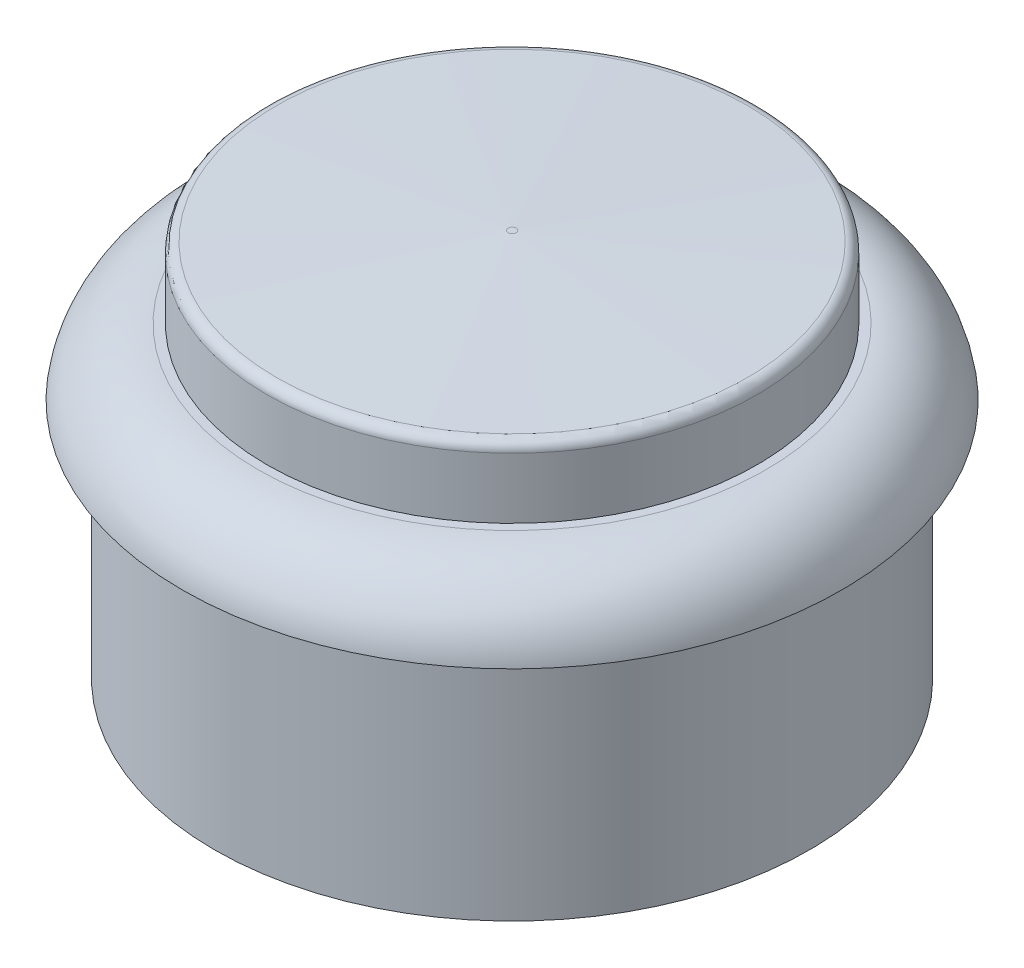
ISO-10303-21;
HEADER;
FILE_DESCRIPTION(('STEP AP214'),'2;1');
FILE_NAME('part.step','',(''),(''),'','','');
FILE_SCHEMA(('AUTOMOTIVE_DESIGN { 1 0 10303 214 1 1 1 1 }'));
ENDSEC;
DATA;
#1=APPLICATION_CONTEXT('core data for automotive mechanical design processes');
#2=APPLICATION_PROTOCOL_DEFINITION('international standard','automotive_design',2000,#1);
#3=PRODUCT_CONTEXT('',#1,'mechanical');
#4=PRODUCT('Part','Part','',(#3));
#5=PRODUCT_RELATED_PRODUCT_CATEGORY('part','',(#4));
#6=PRODUCT_DEFINITION_FORMATION('','',#4);
#7=PRODUCT_DEFINITION_CONTEXT('part definition',#1,'design');
#8=PRODUCT_DEFINITION('design','',#6,#7);
#9=PRODUCT_DEFINITION_SHAPE('','',#8);
#10=(LENGTH_UNIT() NAMED_UNIT(*) SI_UNIT(.MILLI.,.METRE.));
#11=(NAMED_UNIT(*) PLANE_ANGLE_UNIT() SI_UNIT($,.RADIAN.));
#12=(NAMED_UNIT(*) SI_UNIT($,.STERADIAN.) SOLID_ANGLE_UNIT());
#13=UNCERTAINTY_MEASURE_WITH_UNIT(LENGTH_MEASURE(1.E-05),#10,'distance_accuracy_value','');
#14=(GEOMETRIC_REPRESENTATION_CONTEXT(3) GLOBAL_UNCERTAINTY_ASSIGNED_CONTEXT((#13)) GLOBAL_UNIT_ASSIGNED_CONTEXT((#10,
#11,#12)) REPRESENTATION_CONTEXT('',''));
#15=CARTESIAN_POINT('',(0.,0.,0.));
#16=DIRECTION('',(0.,0.,1.));
#17=DIRECTION('',(1.,0.,0.));
#18=AXIS2_PLACEMENT_3D('',#15,#16,#17);
#19=CARTESIAN_POINT('',(0.,12.,0.));
#20=DIRECTION('',(0.,-1.,0.));
#21=DIRECTION('',(0.,0.,-1.));
#22=AXIS2_PLACEMENT_3D('',#19,#20,#21);
#23=CYLINDRICAL_SURFACE('',#22,14.8);
#24=CARTESIAN_POINT('',(0.,12.,0.));
#25=DIRECTION('',(0.,1.,0.));
#26=DIRECTION('',(0.,0.,1.));
#27=AXIS2_PLACEMENT_3D('',#24,#25,#26);
#28=CIRCLE('',#27,14.8);
#29=CARTESIAN_POINT('',(0.,12.,14.8));
#30=VERTEX_POINT('',#29);
#31=EDGE_CURVE('E50',#30,#30,#28,.T.);
#32=ORIENTED_EDGE('',*,*,#31,.F.);
#33=EDGE_LOOP('',(#32));
#34=FACE_BOUND('',#33,.T.);
#35=CARTESIAN_POINT('',(0.,0.,0.));
#36=DIRECTION('',(0.,1.,0.));
#37=DIRECTION('',(0.,0.,1.));
#38=AXIS2_PLACEMENT_3D('',#35,#36,#37);
#39=CIRCLE('',#38,14.8);
#40=CARTESIAN_POINT('',(0.,0.,14.8));
#41=VERTEX_POINT('',#40);
#42=EDGE_CURVE('E51',#41,#41,#39,.T.);
#43=ORIENTED_EDGE('',*,*,#42,.T.);
#44=EDGE_LOOP('',(#43));
#45=FACE_BOUND('',#44,.T.);
#46=ADVANCED_FACE('F30',(#34,#45),#23,.T.);
#47=CARTESIAN_POINT('',(0.,0.,0.));
#48=DIRECTION('',(0.,1.,0.));
#49=DIRECTION('',(0.,0.,1.));
#50=AXIS2_PLACEMENT_3D('',#47,#48,#49);
#51=PLANE('',#50);
#52=ORIENTED_EDGE('',*,*,#42,.F.);
#53=EDGE_LOOP('',(#52));
#54=FACE_BOUND('',#53,.T.);
#55=ADVANCED_FACE('F69',(#54),#51,.F.);
#56=CARTESIAN_POINT('',(0.,15.3,0.));
#57=DIRECTION('',(0.,1.,0.));
#58=DIRECTION('',(0.,0.,1.));
#59=AXIS2_PLACEMENT_3D('',#56,#57,#58);
#60=PLANE('',#59);
#61=CARTESIAN_POINT('',(0.,15.3,0.));
#62=DIRECTION('',(0.,1.,0.));
#63=DIRECTION('',(0.,0.,1.));
#64=AXIS2_PLACEMENT_3D('',#61,#62,#63);
#65=CIRCLE('',#64,12.2);
#66=CARTESIAN_POINT('',(0.,15.3,12.2));
#67=VERTEX_POINT('',#66);
#68=EDGE_CURVE('E59',#67,#67,#65,.T.);
#69=ORIENTED_EDGE('',*,*,#68,.F.);
#70=EDGE_LOOP('',(#69));
#71=FACE_BOUND('',#70,.T.);
#72=CARTESIAN_POINT('',(0.,15.3,0.));
#73=DIRECTION('',(0.,1.,0.));
#74=DIRECTION('',(0.,0.,1.));
#75=AXIS2_PLACEMENT_3D('',#72,#73,#74);
#76=CIRCLE('',#75,12.6330383596325);
#77=CARTESIAN_POINT('',(0.,15.3,12.6330383596325));
#78=VERTEX_POINT('',#77);
#79=EDGE_CURVE('E45',#78,#78,#76,.T.);
#80=ORIENTED_EDGE('',*,*,#79,.T.);
#81=EDGE_LOOP('',(#80));
#82=FACE_BOUND('',#81,.T.);
#83=ADVANCED_FACE('F65',(#71,#82),#60,.T.);
#84=CARTESIAN_POINT('',(0.,12.,0.));
#85=DIRECTION('',(0.,1.,0.));
#86=DIRECTION('',(0.,0.,1.));
#87=AXIS2_PLACEMENT_3D('',#84,#85,#86);
#88=PLANE('',#87);
#89=ORIENTED_EDGE('',*,*,#31,.T.);
#90=EDGE_LOOP('',(#89));
#91=FACE_BOUND('',#90,.T.);
#92=CARTESIAN_POINT('',(0.,12.,0.));
#93=DIRECTION('',(0.,1.,0.));
#94=DIRECTION('',(0.,0.,1.));
#95=AXIS2_PLACEMENT_3D('',#92,#93,#94);
#96=CIRCLE('',#95,16.4);
#97=CARTESIAN_POINT('',(0.,12.,16.4));
#98=VERTEX_POINT('',#97);
#99=EDGE_CURVE('E54',#98,#98,#96,.T.);
#100=ORIENTED_EDGE('',*,*,#99,.F.);
#101=EDGE_LOOP('',(#100));
#102=FACE_BOUND('',#101,.T.);
#103=ADVANCED_FACE('F68',(#91,#102),#88,.F.);
#104=CARTESIAN_POINT('',(0.,11.5,0.));
#105=DIRECTION('',(0.,-1.,0.));
#106=DIRECTION('',(0.,0.,-1.));
#107=AXIS2_PLACEMENT_3D('',#104,#105,#106);
#108=TOROIDAL_SURFACE('',#107,12.6330383596325,3.8);
#109=ORIENTED_EDGE('',*,*,#99,.T.);
#110=EDGE_LOOP('',(#109));
#111=FACE_BOUND('',#110,.T.);
#112=ORIENTED_EDGE('',*,*,#79,.F.);
#113=EDGE_LOOP('',(#112));
#114=FACE_BOUND('',#113,.T.);
#115=ADVANCED_FACE('F73',(#111,#114),#108,.T.);
#116=CARTESIAN_POINT('',(0.,19.3,0.));
#117=DIRECTION('',(0.,-1.,0.));
#118=DIRECTION('',(0.,0.,-1.));
#119=AXIS2_PLACEMENT_3D('',#116,#117,#118);
#120=CYLINDRICAL_SURFACE('',#119,12.2);
#121=CARTESIAN_POINT('',(0.,18.3203994937723,0.));
#122=DIRECTION('',(0.,1.,0.));
#123=DIRECTION('',(0.,0.,1.));
#124=AXIS2_PLACEMENT_3D('',#121,#122,#123);
#125=CIRCLE('',#124,12.2);
#126=CARTESIAN_POINT('',(0.,18.3203994937723,12.2));
#127=VERTEX_POINT('',#126);
#128=EDGE_CURVE('E37',#127,#127,#125,.F.);
#129=ORIENTED_EDGE('',*,*,#128,.T.);
#130=EDGE_LOOP('',(#129));
#131=FACE_BOUND('',#130,.T.);
#132=ORIENTED_EDGE('',*,*,#68,.T.);
#133=EDGE_LOOP('',(#132));
#134=FACE_BOUND('',#133,.T.);
#135=ADVANCED_FACE('F63',(#131,#134),#120,.T.);
#136=CARTESIAN_POINT('',(0.,19.3,0.));
#137=DIRECTION('',(0.,1.,0.));
#138=DIRECTION('',(0.,0.,1.));
#139=AXIS2_PLACEMENT_3D('',#136,#137,#138);
#140=PLANE('',#139);
#141=CARTESIAN_POINT('',(0.,19.3,0.));
#142=DIRECTION('',(0.,1.,0.));
#143=DIRECTION('',(0.,0.,1.));
#144=AXIS2_PLACEMENT_3D('',#141,#142,#143);
#145=CIRCLE('',#144,0.199999999999);
#146=CARTESIAN_POINT('',(0.,19.3,-0.199999999999041));
#147=VERTEX_POINT('',#146);
#148=EDGE_CURVE('E41',#147,#147,#145,.T.);
#149=ORIENTED_EDGE('',*,*,#148,.T.);
#150=EDGE_LOOP('',(#149));
#151=FACE_BOUND('',#150,.T.);
#152=ADVANCED_FACE('F81',(#151),#140,.T.);
#153=CARTESIAN_POINT('',(0.,19.3,0.));
#154=DIRECTION('',(0.,-1.,0.));
#155=DIRECTION('',(0.,0.,-1.));
#156=AXIS2_PLACEMENT_3D('',#153,#154,#155);
#157=CONICAL_SURFACE('',#156,0.199999999999,1.52915374769631);
#158=CARTESIAN_POINT('',(0.,18.8199660303185,0.));
#159=DIRECTION('',(0.,-1.,0.));
#160=DIRECTION('',(0.,0.,-1.));
#161=AXIS2_PLACEMENT_3D('',#158,#159,#160);
#162=CIRCLE('',#161,11.7208152723561);
#163=CARTESIAN_POINT('',(0.,18.8199660303185,-11.7208152723548));
#164=VERTEX_POINT('',#163);
#165=EDGE_CURVE('E10',#164,#164,#162,.F.);
#166=CARTESIAN_POINT('',(0.,18.8199660303185,-11.7208152723548));
#167=CARTESIAN_POINT('',(0.,18.8249663841694,-11.6008067799344));
#168=CARTESIAN_POINT('',(0.,18.8299667380202,-11.4807982875141));
#169=CARTESIAN_POINT('',(0.,18.8399674457219,-11.2407813026733));
#170=CARTESIAN_POINT('',(0.,18.8449677995728,-11.1207728102529));
#171=CARTESIAN_POINT('',(0.,18.8549685072745,-10.8807558254122));
#172=CARTESIAN_POINT('',(0.,18.8599688611253,-10.7607473329918));
#173=CARTESIAN_POINT('',(0.,18.869969568827,-10.5207303481511));
#174=CARTESIAN_POINT('',(0.,18.8749699226779,-10.4007218557307));
#175=CARTESIAN_POINT('',(0.,18.8849706303796,-10.16070487089));
#176=CARTESIAN_POINT('',(0.,18.8899709842304,-10.0406963784696));
#177=CARTESIAN_POINT('',(0.,18.8999716919321,-9.80067939362885));
#178=CARTESIAN_POINT('',(0.,18.904972045783,-9.68067090120848));
#179=CARTESIAN_POINT('',(0.,18.9149727534847,-9.44065391636773));
#180=CARTESIAN_POINT('',(0.,18.9199731073355,-9.32064542394736));
#181=CARTESIAN_POINT('',(0.,18.9299738150372,-9.08062843910661));
#182=CARTESIAN_POINT('',(0.,18.9349741688881,-8.96061994668624));
#183=CARTESIAN_POINT('',(0.,18.9449748765898,-8.7206029618455));
#184=CARTESIAN_POINT('',(0.,18.9499752304406,-8.60059446942513));
#185=CARTESIAN_POINT('',(0.,18.9599759381423,-8.36057748458438));
#186=CARTESIAN_POINT('',(0.,18.9649762919932,-8.24056899216401));
#187=CARTESIAN_POINT('',(0.,18.9749769996949,-8.00055200732326));
#188=CARTESIAN_POINT('',(0.,18.9799773535457,-7.88054351490289));
#189=CARTESIAN_POINT('',(0.,18.9899780612474,-7.64052653006214));
#190=CARTESIAN_POINT('',(0.,18.9949784150982,-7.52051803764177));
#191=CARTESIAN_POINT('',(0.,19.0049791227999,-7.28050105280103));
#192=CARTESIAN_POINT('',(0.,19.0099794766508,-7.16049256038065));
#193=CARTESIAN_POINT('',(0.,19.0199801843525,-6.92047557553991));
#194=CARTESIAN_POINT('',(0.,19.0249805382033,-6.80046708311953));
#195=CARTESIAN_POINT('',(0.,19.034981245905,-6.56045009827879));
#196=CARTESIAN_POINT('',(0.,19.0399815997559,-6.44044160585842));
#197=CARTESIAN_POINT('',(0.,19.0499823074576,-6.20042462101767));
#198=CARTESIAN_POINT('',(0.,19.0549826613084,-6.0804161285973));
#199=CARTESIAN_POINT('',(0.,19.0649833690101,-5.84039914375655));
#200=CARTESIAN_POINT('',(0.,19.069983722861,-5.72039065133618));
#201=CARTESIAN_POINT('',(0.,19.0799844305627,-5.48037366649544));
#202=CARTESIAN_POINT('',(0.,19.0849847844135,-5.36036517407506));
#203=CARTESIAN_POINT('',(0.,19.0949854921152,-5.12034818923432));
#204=CARTESIAN_POINT('',(0.,19.0999858459661,-5.00033969681395));
#205=CARTESIAN_POINT('',(0.,19.1099865536678,-4.7603227119732));
#206=CARTESIAN_POINT('',(0.,19.1149869075186,-4.64031421955283));
#207=CARTESIAN_POINT('',(0.,19.1249876152203,-4.40029723471208));
#208=CARTESIAN_POINT('',(0.,19.1299879690712,-4.28028874229171));
#209=CARTESIAN_POINT('',(0.,19.1399886767728,-4.04027175745097));
#210=CARTESIAN_POINT('',(0.,19.1449890306237,-3.92026326503059));
#211=CARTESIAN_POINT('',(0.,19.1549897383254,-3.68024628018985));
#212=CARTESIAN_POINT('',(0.,19.1599900921762,-3.56023778776947));
#213=CARTESIAN_POINT('',(0.,19.1699907998779,-3.32022080292873));
#214=CARTESIAN_POINT('',(0.,19.1749911537288,-3.20021231050836));
#215=CARTESIAN_POINT('',(0.,19.1849918614305,-2.96019532566761));
#216=CARTESIAN_POINT('',(0.,19.1899922152813,-2.84018683324724));
#217=CARTESIAN_POINT('',(0.,19.199992922983,-2.60016984840649));
#218=CARTESIAN_POINT('',(0.,19.2049932768339,-2.48016135598612));
#219=CARTESIAN_POINT('',(0.,19.2149939845356,-2.24014437114538));
#220=CARTESIAN_POINT('',(0.,19.2199943383864,-2.120135878725));
#221=CARTESIAN_POINT('',(0.,19.2299950460881,-1.88011889388426));
#222=CARTESIAN_POINT('',(0.,19.234995399939,-1.76011040146389));
#223=CARTESIAN_POINT('',(0.,19.2449961076407,-1.52009341662314));
#224=CARTESIAN_POINT('',(0.,19.2499964614915,-1.40008492420277));
#225=CARTESIAN_POINT('',(0.,19.2599971691932,-1.16006793936202));
#226=CARTESIAN_POINT('',(0.,19.2649975230441,-1.04005944694165));
#227=CARTESIAN_POINT('',(0.,19.2749982307458,-0.800042462100904));
#228=CARTESIAN_POINT('',(0.,19.2799985845966,-0.680033969680532));
#229=CARTESIAN_POINT('',(0.,19.2899992922983,-0.440016984839787));
#230=CARTESIAN_POINT('',(0.,19.2949996461491,-0.320008492419414));
#231=CARTESIAN_POINT('',(0.,19.3,-0.199999999999041));
#232=B_SPLINE_CURVE_WITH_KNOTS('',3,(#166,#167,#168,#169,#170,#171,#172,#173,#174,#175,#176,
#177,#178,#179,#180,#181,#182,#183,#184,#185,#186,#187,#188,#189,#190,#191,#192,#193,#194,#195,
#196,#197,#198,#199,#200,#201,#202,#203,#204,#205,#206,#207,#208,#209,#210,#211,#212,#213,#214,
#215,#216,#217,#218,#219,#220,#221,#222,#223,#224,#225,#226,#227,#228,#229,#230,#231),
.UNSPECIFIED.,.F.,.F.,(4,2,2,2,2,2,2,2,2,2,2,2,2,2,2,2,2,2,2,2,2,2,2,2,2,2,2,2,2,2,2,2,4),(0.,
0.360337863851135,0.720675727702271,1.08101359155341,1.44135145540454,1.80168931925567,
2.16202718310681,2.52236504695794,2.88270291080908,3.24304077466021,3.60337863851135,
3.96371650236248,4.32405436621362,4.68439223006475,5.04473009391589,5.40506795776702,
5.76540582161816,6.12574368546929,6.48608154932042,6.84641941317156,7.20675727702269,
7.56709514087383,7.92743300472496,8.2877708685761,8.64810873242723,9.00844659627837,
9.3687844601295,9.72912232398064,10.0894601878318,10.4497980516829,10.810135915534,
11.1704737793852,11.5308116432363),.UNSPECIFIED.);
#233=EDGE_CURVE('BSEAM97',#164,#147,#232,.T.);
#234=ORIENTED_EDGE('',*,*,#165,.T.);
#235=ORIENTED_EDGE('',*,*,#148,.F.);
#236=ORIENTED_EDGE('',*,*,#233,.T.);
#237=ORIENTED_EDGE('',*,*,#233,.F.);
#238=EDGE_LOOP('',(#234,#236,#235,#237));
#239=FACE_BOUND('',#238,.T.);
#240=ADVANCED_FACE('F97',(#239),#157,.T.);
#241=CARTESIAN_POINT('',(0.,18.3203994937723,0.));
#242=DIRECTION('',(0.,1.,0.));
#243=DIRECTION('',(0.,0.,1.));
#244=AXIS2_PLACEMENT_3D('',#241,#242,#243);
#245=TOROIDAL_SURFACE('',#244,11.7,0.5);
#246=ORIENTED_EDGE('',*,*,#165,.F.);
#247=EDGE_LOOP('',(#246));
#248=FACE_BOUND('',#247,.T.);
#249=ORIENTED_EDGE('',*,*,#128,.F.);
#250=EDGE_LOOP('',(#249));
#251=FACE_BOUND('',#250,.T.);
#252=ADVANCED_FACE('F32',(#248,#251),#245,.T.);
#253=CLOSED_SHELL('',(#46,#55,#83,#103,#115,#135,#152,#240,#252));
#254=MANIFOLD_SOLID_BREP('B2',#253);
#255=ADVANCED_BREP_SHAPE_REPRESENTATION('',(#18,#254),#14);
#256=SHAPE_DEFINITION_REPRESENTATION(#9,#255);
ENDSEC;
END-ISO-10303-21;
